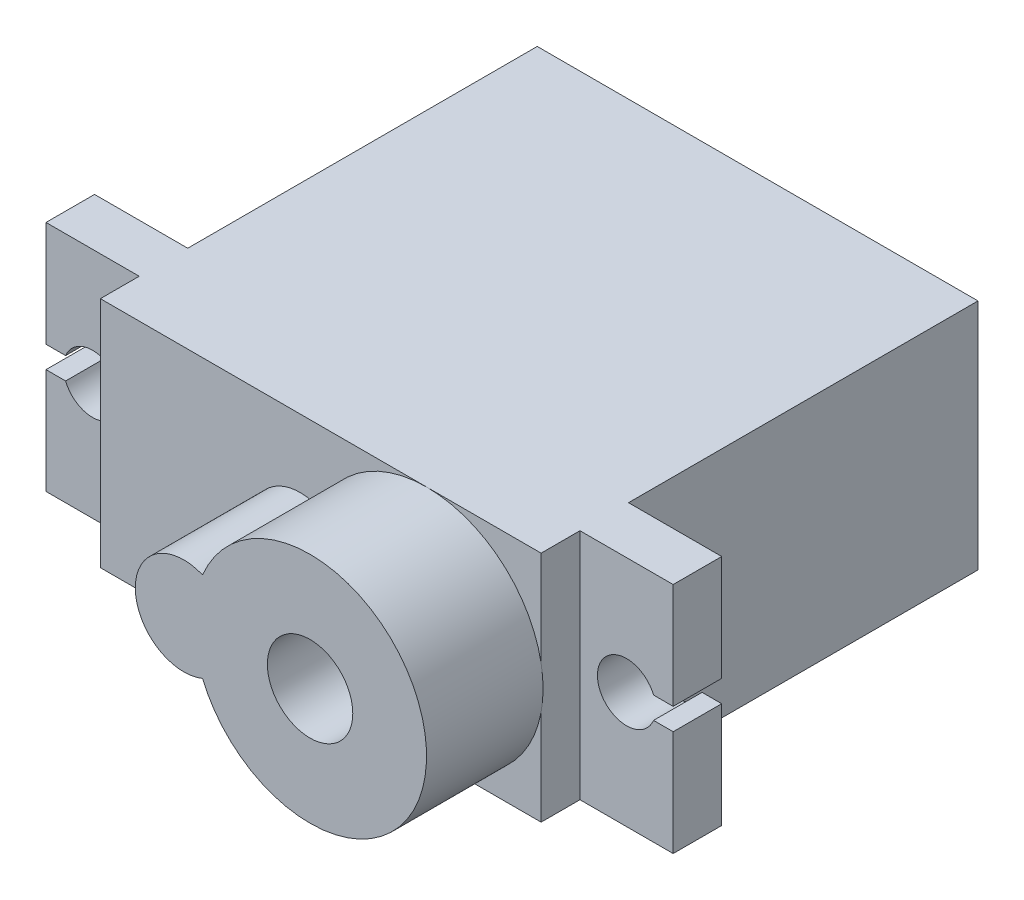
ISO-10303-21;
HEADER;
FILE_DESCRIPTION(('STEP AP214'),'2;1');
FILE_NAME('part.step','',(''),(''),'','','');
FILE_SCHEMA(('AUTOMOTIVE_DESIGN { 1 0 10303 214 1 1 1 1 }'));
ENDSEC;
DATA;
#1=APPLICATION_CONTEXT('core data for automotive mechanical design processes');
#2=APPLICATION_PROTOCOL_DEFINITION('international standard','automotive_design',2000,#1);
#3=PRODUCT_CONTEXT('',#1,'mechanical');
#4=PRODUCT('Part','Part','',(#3));
#5=PRODUCT_RELATED_PRODUCT_CATEGORY('part','',(#4));
#6=PRODUCT_DEFINITION_FORMATION('','',#4);
#7=PRODUCT_DEFINITION_CONTEXT('part definition',#1,'design');
#8=PRODUCT_DEFINITION('design','',#6,#7);
#9=PRODUCT_DEFINITION_SHAPE('','',#8);
#10=(LENGTH_UNIT() NAMED_UNIT(*) SI_UNIT(.MILLI.,.METRE.));
#11=(NAMED_UNIT(*) PLANE_ANGLE_UNIT() SI_UNIT($,.RADIAN.));
#12=(NAMED_UNIT(*) SI_UNIT($,.STERADIAN.) SOLID_ANGLE_UNIT());
#13=UNCERTAINTY_MEASURE_WITH_UNIT(LENGTH_MEASURE(1.E-05),#10,'distance_accuracy_value','');
#14=(GEOMETRIC_REPRESENTATION_CONTEXT(3) GLOBAL_UNCERTAINTY_ASSIGNED_CONTEXT((#13)) GLOBAL_UNIT_ASSIGNED_CONTEXT((#10,
#11,#12)) REPRESENTATION_CONTEXT('',''));
#15=CARTESIAN_POINT('',(0.,0.,0.));
#16=DIRECTION('',(0.,0.,1.));
#17=DIRECTION('',(1.,0.,0.));
#18=AXIS2_PLACEMENT_3D('',#15,#16,#17);
#19=CARTESIAN_POINT('',(-3.68951663117515,5.43498351110742,16.3));
#20=DIRECTION('',(0.,1.,0.));
#21=DIRECTION('',(1.,0.,0.));
#22=AXIS2_PLACEMENT_3D('',#19,#20,#21);
#23=PLANE('',#22);
#24=DIRECTION('',(-1.,0.,0.));
#25=VECTOR('',#24,1.);
#26=CARTESIAN_POINT('',(3.88024168441243,5.43498351110743,18.));
#27=LINE('',#26,#25);
#28=CARTESIAN_POINT('',(-3.68951663117515,5.43498351110742,18.));
#29=VERTEX_POINT('',#28);
#30=CARTESIAN_POINT('',(-4.7,5.43498351110742,18.));
#31=VERTEX_POINT('',#30);
#32=EDGE_CURVE('E306',#29,#31,#27,.T.);
#33=ORIENTED_EDGE('',*,*,#32,.T.);
#34=DIRECTION('',(0.,0.,1.));
#35=VECTOR('',#34,1.);
#36=CARTESIAN_POINT('',(-4.7,5.43498351110742,16.3));
#37=LINE('',#36,#35);
#38=CARTESIAN_POINT('',(-4.7,5.43498351110742,20.5));
#39=VERTEX_POINT('',#38);
#40=EDGE_CURVE('E11',#31,#39,#37,.T.);
#41=ORIENTED_EDGE('',*,*,#40,.T.);
#42=DIRECTION('',(-1.,0.,0.));
#43=VECTOR('',#42,1.);
#44=CARTESIAN_POINT('',(3.88024168441243,5.43498351110743,20.5));
#45=LINE('',#44,#43);
#46=CARTESIAN_POINT('',(-3.68951663117515,5.43498351110742,20.5));
#47=VERTEX_POINT('',#46);
#48=EDGE_CURVE('E331',#47,#39,#45,.T.);
#49=ORIENTED_EDGE('',*,*,#48,.F.);
#50=DIRECTION('',(0.,0.,1.));
#51=VECTOR('',#50,1.);
#52=CARTESIAN_POINT('',(-3.68951663117515,5.43498351110742,16.3));
#53=LINE('',#52,#51);
#54=EDGE_CURVE('E312',#29,#47,#53,.T.);
#55=ORIENTED_EDGE('',*,*,#54,.F.);
#56=EDGE_LOOP('',(#33,#41,#49,#55));
#57=FACE_BOUND('',#56,.T.);
#58=ADVANCED_FACE('F17',(#57),#23,.T.);
#59=CARTESIAN_POINT('',(-4.7,5.43498351110742,16.3));
#60=DIRECTION('',(-1.,0.,0.));
#61=DIRECTION('',(0.,0.,1.));
#62=AXIS2_PLACEMENT_3D('',#59,#60,#61);
#63=PLANE('',#62);
#64=DIRECTION('',(0.,-1.,0.));
#65=VECTOR('',#64,1.);
#66=CARTESIAN_POINT('',(-4.7,5.71749175555371,18.));
#67=LINE('',#66,#65);
#68=CARTESIAN_POINT('',(-4.7,0.,18.));
#69=VERTEX_POINT('',#68);
#70=EDGE_CURVE('E303',#31,#69,#67,.T.);
#71=ORIENTED_EDGE('',*,*,#70,.T.);
#72=DIRECTION('',(0.,0.,1.));
#73=VECTOR('',#72,1.);
#74=CARTESIAN_POINT('',(-4.7,0.,12.225));
#75=LINE('',#74,#73);
#76=CARTESIAN_POINT('',(-4.7,0.,20.5));
#77=VERTEX_POINT('',#76);
#78=EDGE_CURVE('E506',#69,#77,#75,.T.);
#79=ORIENTED_EDGE('',*,*,#78,.T.);
#80=DIRECTION('',(0.,-1.,0.));
#81=VECTOR('',#80,1.);
#82=CARTESIAN_POINT('',(-4.7,5.71749175555371,20.5));
#83=LINE('',#82,#81);
#84=EDGE_CURVE('E335',#39,#77,#83,.T.);
#85=ORIENTED_EDGE('',*,*,#84,.F.);
#86=ORIENTED_EDGE('',*,*,#40,.F.);
#87=EDGE_LOOP('',(#71,#79,#85,#86));
#88=FACE_BOUND('',#87,.T.);
#89=ADVANCED_FACE('F578',(#88),#63,.T.);
#90=CARTESIAN_POINT('',(27.6,0.,16.3));
#91=DIRECTION('',(1.,0.,0.));
#92=DIRECTION('',(0.,1.,0.));
#93=AXIS2_PLACEMENT_3D('',#90,#91,#92);
#94=PLANE('',#93);
#95=DIRECTION('',(0.,1.,0.));
#96=VECTOR('',#95,1.);
#97=CARTESIAN_POINT('',(27.6,3.,18.));
#98=LINE('',#97,#96);
#99=CARTESIAN_POINT('',(27.6,0.,18.));
#100=VERTEX_POINT('',#99);
#101=CARTESIAN_POINT('',(27.6,5.43498351110742,18.));
#102=VERTEX_POINT('',#101);
#103=EDGE_CURVE('E450',#100,#102,#98,.T.);
#104=ORIENTED_EDGE('',*,*,#103,.T.);
#105=DIRECTION('',(0.,0.,1.));
#106=VECTOR('',#105,1.);
#107=CARTESIAN_POINT('',(27.6,5.43498351110742,16.3));
#108=LINE('',#107,#106);
#109=CARTESIAN_POINT('',(27.6,5.43498351110742,20.5));
#110=VERTEX_POINT('',#109);
#111=EDGE_CURVE('E20',#102,#110,#108,.T.);
#112=ORIENTED_EDGE('',*,*,#111,.T.);
#113=DIRECTION('',(0.,1.,0.));
#114=VECTOR('',#113,1.);
#115=CARTESIAN_POINT('',(27.6,3.,20.5));
#116=LINE('',#115,#114);
#117=CARTESIAN_POINT('',(27.6,0.,20.5));
#118=VERTEX_POINT('',#117);
#119=EDGE_CURVE('E391',#118,#110,#116,.T.);
#120=ORIENTED_EDGE('',*,*,#119,.F.);
#121=DIRECTION('',(0.,0.,1.));
#122=VECTOR('',#121,1.);
#123=CARTESIAN_POINT('',(27.6,0.,12.225));
#124=LINE('',#123,#122);
#125=EDGE_CURVE('E277',#100,#118,#124,.T.);
#126=ORIENTED_EDGE('',*,*,#125,.F.);
#127=EDGE_LOOP('',(#104,#112,#120,#126));
#128=FACE_BOUND('',#127,.T.);
#129=ADVANCED_FACE('F603',(#128),#94,.T.);
#130=CARTESIAN_POINT('',(27.7,5.43498351110742,16.3));
#131=DIRECTION('',(0.,1.,0.));
#132=DIRECTION('',(1.,0.,0.));
#133=AXIS2_PLACEMENT_3D('',#130,#131,#132);
#134=PLANE('',#133);
#135=DIRECTION('',(1.,0.,0.));
#136=VECTOR('',#135,1.);
#137=CARTESIAN_POINT('',(19.575,5.43498351110743,18.));
#138=LINE('',#137,#136);
#139=CARTESIAN_POINT('',(26.5895166311751,5.43498351110742,18.));
#140=VERTEX_POINT('',#139);
#141=EDGE_CURVE('E446',#140,#102,#138,.T.);
#142=ORIENTED_EDGE('',*,*,#141,.F.);
#143=DIRECTION('',(0.,0.,1.));
#144=VECTOR('',#143,1.);
#145=CARTESIAN_POINT('',(26.5895166311751,5.43498351110742,16.3));
#146=LINE('',#145,#144);
#147=CARTESIAN_POINT('',(26.5895166311751,5.43498351110742,20.5));
#148=VERTEX_POINT('',#147);
#149=EDGE_CURVE('E396',#140,#148,#146,.T.);
#150=ORIENTED_EDGE('',*,*,#149,.T.);
#151=DIRECTION('',(-1.,0.,0.));
#152=VECTOR('',#151,1.);
#153=CARTESIAN_POINT('',(19.575,5.43498351110743,20.5));
#154=LINE('',#153,#152);
#155=EDGE_CURVE('E395',#110,#148,#154,.T.);
#156=ORIENTED_EDGE('',*,*,#155,.F.);
#157=ORIENTED_EDGE('',*,*,#111,.F.);
#158=EDGE_LOOP('',(#142,#150,#156,#157));
#159=FACE_BOUND('',#158,.T.);
#160=ADVANCED_FACE('F607',(#159),#134,.T.);
#161=CARTESIAN_POINT('',(25.2,6.,16.3));
#162=DIRECTION('',(0.,0.,1.));
#163=DIRECTION('',(-1.,0.,0.));
#164=AXIS2_PLACEMENT_3D('',#161,#162,#163);
#165=CYLINDRICAL_SURFACE('',#164,1.50000003367761);
#166=CARTESIAN_POINT('',(25.2,6.,18.));
#167=DIRECTION('',(0.,0.,1.));
#168=DIRECTION('',(-1.,0.,0.));
#169=AXIS2_PLACEMENT_3D('',#166,#167,#168);
#170=CIRCLE('',#169,1.50000003367761);
#171=CARTESIAN_POINT('',(26.5895166311751,6.56501648889258,18.));
#172=VERTEX_POINT('',#171);
#173=EDGE_CURVE('E441',#172,#140,#170,.T.);
#174=ORIENTED_EDGE('',*,*,#173,.F.);
#175=DIRECTION('',(0.,0.,1.));
#176=VECTOR('',#175,1.);
#177=CARTESIAN_POINT('',(26.5895166311751,6.56501648889258,16.3));
#178=LINE('',#177,#176);
#179=CARTESIAN_POINT('',(26.5895166311751,6.56501648889258,20.5));
#180=VERTEX_POINT('',#179);
#181=EDGE_CURVE('E399',#172,#180,#178,.T.);
#182=ORIENTED_EDGE('',*,*,#181,.T.);
#183=CARTESIAN_POINT('',(25.2,6.,20.5));
#184=DIRECTION('',(0.,0.,-1.));
#185=DIRECTION('',(-1.,0.,0.));
#186=AXIS2_PLACEMENT_3D('',#183,#184,#185);
#187=CIRCLE('',#186,1.50000003367761);
#188=EDGE_CURVE('E285',#148,#180,#187,.T.);
#189=ORIENTED_EDGE('',*,*,#188,.F.);
#190=ORIENTED_EDGE('',*,*,#149,.F.);
#191=EDGE_LOOP('',(#174,#182,#189,#190));
#192=FACE_BOUND('',#191,.T.);
#193=ADVANCED_FACE('F613',(#192),#165,.F.);
#194=CARTESIAN_POINT('',(26.5895166311751,6.56501648889258,16.3));
#195=DIRECTION('',(0.,-1.,0.));
#196=DIRECTION('',(0.,0.,-1.));
#197=AXIS2_PLACEMENT_3D('',#194,#195,#196);
#198=PLANE('',#197);
#199=DIRECTION('',(1.,0.,0.));
#200=VECTOR('',#199,1.);
#201=CARTESIAN_POINT('',(19.0197583155876,6.56501648889257,18.));
#202=LINE('',#201,#200);
#203=CARTESIAN_POINT('',(27.6,6.56501648889258,18.));
#204=VERTEX_POINT('',#203);
#205=EDGE_CURVE('E435',#172,#204,#202,.T.);
#206=ORIENTED_EDGE('',*,*,#205,.T.);
#207=DIRECTION('',(0.,0.,1.));
#208=VECTOR('',#207,1.);
#209=CARTESIAN_POINT('',(27.6,6.56501648889258,16.3));
#210=LINE('',#209,#208);
#211=CARTESIAN_POINT('',(27.6,6.56501648889258,20.5));
#212=VERTEX_POINT('',#211);
#213=EDGE_CURVE('E469',#204,#212,#210,.T.);
#214=ORIENTED_EDGE('',*,*,#213,.T.);
#215=DIRECTION('',(1.,0.,0.));
#216=VECTOR('',#215,1.);
#217=CARTESIAN_POINT('',(19.0197583155876,6.56501648889257,20.5));
#218=LINE('',#217,#216);
#219=EDGE_CURVE('E281',#180,#212,#218,.T.);
#220=ORIENTED_EDGE('',*,*,#219,.F.);
#221=ORIENTED_EDGE('',*,*,#181,.F.);
#222=EDGE_LOOP('',(#206,#214,#220,#221));
#223=FACE_BOUND('',#222,.T.);
#224=ADVANCED_FACE('F615',(#223),#198,.T.);
#225=CARTESIAN_POINT('',(27.6,6.56501648889258,16.3));
#226=DIRECTION('',(1.,0.,0.));
#227=DIRECTION('',(0.,1.,0.));
#228=AXIS2_PLACEMENT_3D('',#225,#226,#227);
#229=PLANE('',#228);
#230=DIRECTION('',(0.,1.,0.));
#231=VECTOR('',#230,1.);
#232=CARTESIAN_POINT('',(27.6,6.28250824444629,18.));
#233=LINE('',#232,#231);
#234=CARTESIAN_POINT('',(27.6,12.,18.));
#235=VERTEX_POINT('',#234);
#236=EDGE_CURVE('E432',#204,#235,#233,.T.);
#237=ORIENTED_EDGE('',*,*,#236,.T.);
#238=DIRECTION('',(0.,0.,1.));
#239=VECTOR('',#238,1.);
#240=CARTESIAN_POINT('',(27.6,12.,12.225));
#241=LINE('',#240,#239);
#242=CARTESIAN_POINT('',(27.6,12.,20.5));
#243=VERTEX_POINT('',#242);
#244=EDGE_CURVE('E358',#235,#243,#241,.T.);
#245=ORIENTED_EDGE('',*,*,#244,.T.);
#246=DIRECTION('',(0.,1.,0.));
#247=VECTOR('',#246,1.);
#248=CARTESIAN_POINT('',(27.6,6.28250824444629,20.5));
#249=LINE('',#248,#247);
#250=EDGE_CURVE('E284',#212,#243,#249,.T.);
#251=ORIENTED_EDGE('',*,*,#250,.F.);
#252=ORIENTED_EDGE('',*,*,#213,.F.);
#253=EDGE_LOOP('',(#237,#245,#251,#252));
#254=FACE_BOUND('',#253,.T.);
#255=ADVANCED_FACE('F597',(#254),#229,.T.);
#256=CARTESIAN_POINT('',(-4.7,12.,16.3));
#257=DIRECTION('',(-1.,0.,0.));
#258=DIRECTION('',(0.,0.,1.));
#259=AXIS2_PLACEMENT_3D('',#256,#257,#258);
#260=PLANE('',#259);
#261=DIRECTION('',(0.,-1.,0.));
#262=VECTOR('',#261,1.);
#263=CARTESIAN_POINT('',(-4.7,9.,18.));
#264=LINE('',#263,#262);
#265=CARTESIAN_POINT('',(-4.7,12.,18.));
#266=VERTEX_POINT('',#265);
#267=CARTESIAN_POINT('',(-4.7,6.56501648889258,18.));
#268=VERTEX_POINT('',#267);
#269=EDGE_CURVE('E428',#266,#268,#264,.T.);
#270=ORIENTED_EDGE('',*,*,#269,.T.);
#271=DIRECTION('',(0.,0.,1.));
#272=VECTOR('',#271,1.);
#273=CARTESIAN_POINT('',(-4.7,6.56501648889258,16.3));
#274=LINE('',#273,#272);
#275=CARTESIAN_POINT('',(-4.7,6.56501648889258,20.5));
#276=VERTEX_POINT('',#275);
#277=EDGE_CURVE('E467',#268,#276,#274,.T.);
#278=ORIENTED_EDGE('',*,*,#277,.T.);
#279=DIRECTION('',(0.,-1.,0.));
#280=VECTOR('',#279,1.);
#281=CARTESIAN_POINT('',(-4.7,9.,20.5));
#282=LINE('',#281,#280);
#283=CARTESIAN_POINT('',(-4.7,12.,20.5));
#284=VERTEX_POINT('',#283);
#285=EDGE_CURVE('E319',#284,#276,#282,.T.);
#286=ORIENTED_EDGE('',*,*,#285,.F.);
#287=DIRECTION('',(0.,0.,1.));
#288=VECTOR('',#287,1.);
#289=CARTESIAN_POINT('',(-4.7,12.,12.225));
#290=LINE('',#289,#288);
#291=EDGE_CURVE('E336',#266,#284,#290,.T.);
#292=ORIENTED_EDGE('',*,*,#291,.F.);
#293=EDGE_LOOP('',(#270,#278,#286,#292));
#294=FACE_BOUND('',#293,.T.);
#295=ADVANCED_FACE('F564',(#294),#260,.T.);
#296=CARTESIAN_POINT('',(-4.8,6.56501648889258,16.3));
#297=DIRECTION('',(0.,-1.,0.));
#298=DIRECTION('',(-1.,0.,0.));
#299=AXIS2_PLACEMENT_3D('',#296,#297,#298);
#300=PLANE('',#299);
#301=DIRECTION('',(-1.,0.,0.));
#302=VECTOR('',#301,1.);
#303=CARTESIAN_POINT('',(3.325,6.56501648889257,18.));
#304=LINE('',#303,#302);
#305=CARTESIAN_POINT('',(-3.68951663117515,6.56501648889258,18.));
#306=VERTEX_POINT('',#305);
#307=EDGE_CURVE('E424',#306,#268,#304,.T.);
#308=ORIENTED_EDGE('',*,*,#307,.F.);
#309=DIRECTION('',(0.,0.,1.));
#310=VECTOR('',#309,1.);
#311=CARTESIAN_POINT('',(-3.68951663117515,6.56501648889258,16.3));
#312=LINE('',#311,#310);
#313=CARTESIAN_POINT('',(-3.68951663117515,6.56501648889258,20.5));
#314=VERTEX_POINT('',#313);
#315=EDGE_CURVE('E315',#306,#314,#312,.T.);
#316=ORIENTED_EDGE('',*,*,#315,.T.);
#317=DIRECTION('',(1.,0.,0.));
#318=VECTOR('',#317,1.);
#319=CARTESIAN_POINT('',(3.325,6.56501648889257,20.5));
#320=LINE('',#319,#318);
#321=EDGE_CURVE('E323',#276,#314,#320,.T.);
#322=ORIENTED_EDGE('',*,*,#321,.F.);
#323=ORIENTED_EDGE('',*,*,#277,.F.);
#324=EDGE_LOOP('',(#308,#316,#322,#323));
#325=FACE_BOUND('',#324,.T.);
#326=ADVANCED_FACE('F587',(#325),#300,.T.);
#327=CARTESIAN_POINT('',(-2.3,6.,16.3));
#328=DIRECTION('',(0.,0.,1.));
#329=DIRECTION('',(1.,0.,0.));
#330=AXIS2_PLACEMENT_3D('',#327,#328,#329);
#331=CYLINDRICAL_SURFACE('',#330,1.50000003367761);
#332=CARTESIAN_POINT('',(-2.3,6.,18.));
#333=DIRECTION('',(0.,0.,1.));
#334=DIRECTION('',(1.,0.,0.));
#335=AXIS2_PLACEMENT_3D('',#332,#333,#334);
#336=CIRCLE('',#335,1.50000003367761);
#337=EDGE_CURVE('E388',#29,#306,#336,.T.);
#338=ORIENTED_EDGE('',*,*,#337,.F.);
#339=ORIENTED_EDGE('',*,*,#54,.T.);
#340=CARTESIAN_POINT('',(-2.3,6.,20.5));
#341=DIRECTION('',(0.,0.,-1.));
#342=DIRECTION('',(1.,0.,0.));
#343=AXIS2_PLACEMENT_3D('',#340,#341,#342);
#344=CIRCLE('',#343,1.50000003367761);
#345=EDGE_CURVE('E327',#314,#47,#344,.T.);
#346=ORIENTED_EDGE('',*,*,#345,.F.);
#347=ORIENTED_EDGE('',*,*,#315,.F.);
#348=EDGE_LOOP('',(#338,#339,#346,#347));
#349=FACE_BOUND('',#348,.T.);
#350=ADVANCED_FACE('F585',(#349),#331,.F.);
#351=CARTESIAN_POINT('',(16.9,6.,22.8));
#352=DIRECTION('',(0.,0.,1.));
#353=DIRECTION('',(1.,0.,0.));
#354=AXIS2_PLACEMENT_3D('',#351,#352,#353);
#355=CYLINDRICAL_SURFACE('',#354,6.);
#356=CARTESIAN_POINT('',(16.9,6.,22.5));
#357=DIRECTION('',(0.,0.,1.));
#358=DIRECTION('',(-0.923076923076922,-0.384615384615386,0.));
#359=AXIS2_PLACEMENT_3D('',#356,#357,#358);
#360=CIRCLE('',#359,6.);
#361=CARTESIAN_POINT('',(22.8,7.09087121146356,22.5));
#362=VERTEX_POINT('',#361);
#363=CARTESIAN_POINT('',(16.9,12.,22.5));
#364=VERTEX_POINT('',#363);
#365=EDGE_CURVE('E454',#362,#364,#360,.T.);
#366=ORIENTED_EDGE('',*,*,#365,.T.);
#367=CARTESIAN_POINT('',(16.9,6.,22.5));
#368=DIRECTION('',(0.,0.,-1.));
#369=DIRECTION('',(1.,0.,0.));
#370=AXIS2_PLACEMENT_3D('',#367,#368,#369);
#371=CIRCLE('',#370,6.);
#372=CARTESIAN_POINT('',(11.3615384615385,8.30769230769232,22.5));
#373=VERTEX_POINT('',#372);
#374=EDGE_CURVE('E353',#373,#364,#371,.T.);
#375=ORIENTED_EDGE('',*,*,#374,.F.);
#376=DIRECTION('',(0.,0.,-1.));
#377=VECTOR('',#376,1.);
#378=CARTESIAN_POINT('',(11.3615384615385,8.30769230769232,22.8));
#379=LINE('',#378,#377);
#380=CARTESIAN_POINT('',(11.3615384615385,8.30769230769232,28.5));
#381=VERTEX_POINT('',#380);
#382=EDGE_CURVE('E48',#381,#373,#379,.T.);
#383=ORIENTED_EDGE('',*,*,#382,.F.);
#384=CARTESIAN_POINT('',(16.9,6.,28.5));
#385=DIRECTION('',(0.,0.,1.));
#386=DIRECTION('',(-0.923076923076922,-0.384615384615386,0.));
#387=AXIS2_PLACEMENT_3D('',#384,#385,#386);
#388=CIRCLE('',#387,6.);
#389=CARTESIAN_POINT('',(11.3615384615385,3.69230769230768,28.5));
#390=VERTEX_POINT('',#389);
#391=EDGE_CURVE('E495',#390,#381,#388,.T.);
#392=ORIENTED_EDGE('',*,*,#391,.F.);
#393=DIRECTION('',(0.,0.,1.));
#394=VECTOR('',#393,1.);
#395=CARTESIAN_POINT('',(11.3615384615385,3.69230769230768,22.8));
#396=LINE('',#395,#394);
#397=CARTESIAN_POINT('',(11.3615384615385,3.69230769230768,22.5));
#398=VERTEX_POINT('',#397);
#399=EDGE_CURVE('E414',#398,#390,#396,.T.);
#400=ORIENTED_EDGE('',*,*,#399,.F.);
#401=CARTESIAN_POINT('',(16.9,6.,22.5));
#402=DIRECTION('',(0.,0.,-1.));
#403=DIRECTION('',(1.,0.,0.));
#404=AXIS2_PLACEMENT_3D('',#401,#402,#403);
#405=CIRCLE('',#404,6.);
#406=CARTESIAN_POINT('',(16.9,0.,22.5));
#407=VERTEX_POINT('',#406);
#408=EDGE_CURVE('E354',#407,#398,#405,.T.);
#409=ORIENTED_EDGE('',*,*,#408,.F.);
#410=CARTESIAN_POINT('',(16.9,6.,22.5));
#411=DIRECTION('',(0.,0.,1.));
#412=DIRECTION('',(-0.923076923076922,-0.384615384615386,0.));
#413=AXIS2_PLACEMENT_3D('',#410,#411,#412);
#414=CIRCLE('',#413,6.);
#415=CARTESIAN_POINT('',(22.8,4.90912878853644,22.5));
#416=VERTEX_POINT('',#415);
#417=EDGE_CURVE('E259',#407,#416,#414,.T.);
#418=ORIENTED_EDGE('',*,*,#417,.T.);
#419=CARTESIAN_POINT('',(16.9,6.,22.5));
#420=DIRECTION('',(0.,0.,-1.));
#421=DIRECTION('',(1.,0.,0.));
#422=AXIS2_PLACEMENT_3D('',#419,#420,#421);
#423=CIRCLE('',#422,6.);
#424=EDGE_CURVE('E375',#362,#416,#423,.T.);
#425=ORIENTED_EDGE('',*,*,#424,.F.);
#426=EDGE_LOOP('',(#366,#375,#383,#392,#400,#409,#418,#425));
#427=FACE_BOUND('',#426,.T.);
#428=ADVANCED_FACE('F595',(#427),#355,.T.);
#429=CARTESIAN_POINT('',(10.4,6.,22.8));
#430=DIRECTION('',(0.,0.,1.));
#431=DIRECTION('',(-1.,0.,0.));
#432=AXIS2_PLACEMENT_3D('',#429,#430,#431);
#433=CYLINDRICAL_SURFACE('',#432,2.5);
#434=ORIENTED_EDGE('',*,*,#399,.T.);
#435=CARTESIAN_POINT('',(10.4,6.,28.5));
#436=DIRECTION('',(0.,0.,1.));
#437=DIRECTION('',(0.384615384615384,0.923076923076923,0.));
#438=AXIS2_PLACEMENT_3D('',#435,#436,#437);
#439=CIRCLE('',#438,2.5);
#440=EDGE_CURVE('E490',#381,#390,#439,.T.);
#441=ORIENTED_EDGE('',*,*,#440,.F.);
#442=ORIENTED_EDGE('',*,*,#382,.T.);
#443=CARTESIAN_POINT('',(10.4,6.,22.5));
#444=DIRECTION('',(0.,0.,1.));
#445=DIRECTION('',(0.384615384615384,0.923076923076923,0.));
#446=AXIS2_PLACEMENT_3D('',#443,#444,#445);
#447=CIRCLE('',#446,2.5);
#448=EDGE_CURVE('E350',#373,#398,#447,.T.);
#449=ORIENTED_EDGE('',*,*,#448,.T.);
#450=EDGE_LOOP('',(#434,#441,#442,#449));
#451=FACE_BOUND('',#450,.T.);
#452=ADVANCED_FACE('F640',(#451),#433,.T.);
#453=CARTESIAN_POINT('',(16.9,6.,22.8));
#454=DIRECTION('',(0.,0.,1.));
#455=DIRECTION('',(1.,0.,0.));
#456=AXIS2_PLACEMENT_3D('',#453,#454,#455);
#457=PLANE('',#456);
#458=CARTESIAN_POINT('',(16.9,6.,22.8));
#459=DIRECTION('',(0.,0.,1.));
#460=DIRECTION('',(-1.,0.,0.));
#461=AXIS2_PLACEMENT_3D('',#458,#459,#460);
#462=CIRCLE('',#461,2.2);
#463=CARTESIAN_POINT('',(19.1,6.,22.8));
#464=VERTEX_POINT('',#463);
#465=EDGE_CURVE('E438',#464,#464,#462,.T.);
#466=ORIENTED_EDGE('',*,*,#465,.T.);
#467=EDGE_LOOP('',(#466));
#468=FACE_BOUND('',#467,.T.);
#469=ADVANCED_FACE('F650',(#468),#457,.T.);
#470=CARTESIAN_POINT('',(16.9,6.,22.8));
#471=DIRECTION('',(0.,0.,1.));
#472=DIRECTION('',(-1.,0.,0.));
#473=AXIS2_PLACEMENT_3D('',#470,#471,#472);
#474=CYLINDRICAL_SURFACE('',#473,2.2);
#475=ORIENTED_EDGE('',*,*,#465,.F.);
#476=DIRECTION('',(0.,0.,1.));
#477=VECTOR('',#476,1.);
#478=CARTESIAN_POINT('',(19.1,6.,22.8));
#479=LINE('',#478,#477);
#480=CARTESIAN_POINT('',(19.1,6.,28.5));
#481=VERTEX_POINT('',#480);
#482=EDGE_CURVE('E38',#464,#481,#479,.T.);
#483=ORIENTED_EDGE('',*,*,#482,.T.);
#484=CARTESIAN_POINT('',(16.9,6.,28.5));
#485=DIRECTION('',(0.,0.,-1.));
#486=DIRECTION('',(-1.,0.,0.));
#487=AXIS2_PLACEMENT_3D('',#484,#485,#486);
#488=CIRCLE('',#487,2.2);
#489=EDGE_CURVE('E494',#481,#481,#488,.T.);
#490=ORIENTED_EDGE('',*,*,#489,.F.);
#491=ORIENTED_EDGE('',*,*,#482,.F.);
#492=EDGE_LOOP('',(#475,#483,#490,#491));
#493=FACE_BOUND('',#492,.T.);
#494=ADVANCED_FACE('F651',(#493),#474,.F.);
#495=CARTESIAN_POINT('',(11.45,6.,22.5));
#496=DIRECTION('',(0.,0.,1.));
#497=DIRECTION('',(1.,0.,0.));
#498=AXIS2_PLACEMENT_3D('',#495,#496,#497);
#499=PLANE('',#498);
#500=DIRECTION('',(0.,-1.,0.));
#501=VECTOR('',#500,1.);
#502=CARTESIAN_POINT('',(22.8,3.,22.5));
#503=LINE('',#502,#501);
#504=CARTESIAN_POINT('',(22.8,0.,22.5));
#505=VERTEX_POINT('',#504);
#506=EDGE_CURVE('E243',#416,#505,#503,.T.);
#507=ORIENTED_EDGE('',*,*,#506,.F.);
#508=ORIENTED_EDGE('',*,*,#417,.F.);
#509=DIRECTION('',(-1.,0.,0.));
#510=VECTOR('',#509,1.);
#511=CARTESIAN_POINT('',(11.45,0.,22.5));
#512=LINE('',#511,#510);
#513=EDGE_CURVE('E257',#505,#407,#512,.T.);
#514=ORIENTED_EDGE('',*,*,#513,.F.);
#515=EDGE_LOOP('',(#507,#508,#514));
#516=FACE_BOUND('',#515,.T.);
#517=ADVANCED_FACE('F258',(#516),#499,.T.);
#518=CARTESIAN_POINT('',(11.45,6.,22.5));
#519=DIRECTION('',(0.,0.,1.));
#520=DIRECTION('',(1.,0.,0.));
#521=AXIS2_PLACEMENT_3D('',#518,#519,#520);
#522=PLANE('',#521);
#523=DIRECTION('',(0.,-1.,0.));
#524=VECTOR('',#523,1.);
#525=CARTESIAN_POINT('',(22.8,3.,22.5));
#526=LINE('',#525,#524);
#527=EDGE_CURVE('E251',#362,#416,#526,.T.);
#528=ORIENTED_EDGE('',*,*,#527,.F.);
#529=ORIENTED_EDGE('',*,*,#424,.T.);
#530=EDGE_LOOP('',(#528,#529));
#531=FACE_BOUND('',#530,.T.);
#532=ADVANCED_FACE('F637',(#531),#522,.F.);
#533=CARTESIAN_POINT('',(11.45,6.,22.5));
#534=DIRECTION('',(0.,0.,1.));
#535=DIRECTION('',(1.,0.,0.));
#536=AXIS2_PLACEMENT_3D('',#533,#534,#535);
#537=PLANE('',#536);
#538=DIRECTION('',(-1.,0.,0.));
#539=VECTOR('',#538,1.);
#540=CARTESIAN_POINT('',(11.45,0.,22.5));
#541=LINE('',#540,#539);
#542=CARTESIAN_POINT('',(0.1,0.,22.5));
#543=VERTEX_POINT('',#542);
#544=EDGE_CURVE('E264',#407,#543,#541,.T.);
#545=ORIENTED_EDGE('',*,*,#544,.F.);
#546=ORIENTED_EDGE('',*,*,#408,.T.);
#547=ORIENTED_EDGE('',*,*,#448,.F.);
#548=ORIENTED_EDGE('',*,*,#374,.T.);
#549=DIRECTION('',(1.,0.,0.));
#550=VECTOR('',#549,1.);
#551=CARTESIAN_POINT('',(11.45,12.,22.5));
#552=LINE('',#551,#550);
#553=CARTESIAN_POINT('',(0.1,12.,22.5));
#554=VERTEX_POINT('',#553);
#555=EDGE_CURVE('E298',#554,#364,#552,.T.);
#556=ORIENTED_EDGE('',*,*,#555,.F.);
#557=DIRECTION('',(0.,1.,0.));
#558=VECTOR('',#557,1.);
#559=CARTESIAN_POINT('',(0.1,9.,22.5));
#560=LINE('',#559,#558);
#561=EDGE_CURVE('E288',#543,#554,#560,.T.);
#562=ORIENTED_EDGE('',*,*,#561,.F.);
#563=EDGE_LOOP('',(#545,#546,#547,#548,#556,#562));
#564=FACE_BOUND('',#563,.T.);
#565=ADVANCED_FACE('F573',(#564),#537,.T.);
#566=CARTESIAN_POINT('',(22.9,0.,0.));
#567=DIRECTION('',(0.,0.,-1.));
#568=DIRECTION('',(0.,-1.,0.));
#569=AXIS2_PLACEMENT_3D('',#566,#567,#568);
#570=PLANE('',#569);
#571=DIRECTION('',(0.,1.,0.));
#572=VECTOR('',#571,1.);
#573=CARTESIAN_POINT('',(0.1,0.,0.));
#574=LINE('',#573,#572);
#575=CARTESIAN_POINT('',(0.1,0.,0.));
#576=VERTEX_POINT('',#575);
#577=CARTESIAN_POINT('',(0.1,12.,0.));
#578=VERTEX_POINT('',#577);
#579=EDGE_CURVE('E410',#576,#578,#574,.T.);
#580=ORIENTED_EDGE('',*,*,#579,.T.);
#581=DIRECTION('',(-1.,0.,0.));
#582=VECTOR('',#581,1.);
#583=CARTESIAN_POINT('',(17.175,12.,0.));
#584=LINE('',#583,#582);
#585=CARTESIAN_POINT('',(22.8,12.,0.));
#586=VERTEX_POINT('',#585);
#587=EDGE_CURVE('E374',#586,#578,#584,.T.);
#588=ORIENTED_EDGE('',*,*,#587,.F.);
#589=DIRECTION('',(0.,1.,0.));
#590=VECTOR('',#589,1.);
#591=CARTESIAN_POINT('',(22.8,0.,0.));
#592=LINE('',#591,#590);
#593=CARTESIAN_POINT('',(22.8,0.,0.));
#594=VERTEX_POINT('',#593);
#595=EDGE_CURVE('E413',#594,#586,#592,.T.);
#596=ORIENTED_EDGE('',*,*,#595,.F.);
#597=DIRECTION('',(-1.,0.,0.));
#598=VECTOR('',#597,1.);
#599=CARTESIAN_POINT('',(17.175,0.,0.));
#600=LINE('',#599,#598);
#601=EDGE_CURVE('E488',#594,#576,#600,.T.);
#602=ORIENTED_EDGE('',*,*,#601,.T.);
#603=EDGE_LOOP('',(#580,#588,#596,#602));
#604=FACE_BOUND('',#603,.T.);
#605=ADVANCED_FACE('F539',(#604),#570,.T.);
#606=CARTESIAN_POINT('',(11.45,6.,22.5));
#607=DIRECTION('',(0.,0.,1.));
#608=DIRECTION('',(1.,0.,0.));
#609=AXIS2_PLACEMENT_3D('',#606,#607,#608);
#610=PLANE('',#609);
#611=DIRECTION('',(1.,0.,0.));
#612=VECTOR('',#611,1.);
#613=CARTESIAN_POINT('',(11.45,12.,22.5));
#614=LINE('',#613,#612);
#615=CARTESIAN_POINT('',(22.8,12.,22.5));
#616=VERTEX_POINT('',#615);
#617=EDGE_CURVE('E293',#364,#616,#614,.T.);
#618=ORIENTED_EDGE('',*,*,#617,.F.);
#619=ORIENTED_EDGE('',*,*,#365,.F.);
#620=DIRECTION('',(0.,-1.,0.));
#621=VECTOR('',#620,1.);
#622=CARTESIAN_POINT('',(22.8,3.,22.5));
#623=LINE('',#622,#621);
#624=EDGE_CURVE('E403',#616,#362,#623,.T.);
#625=ORIENTED_EDGE('',*,*,#624,.F.);
#626=EDGE_LOOP('',(#618,#619,#625));
#627=FACE_BOUND('',#626,.T.);
#628=ADVANCED_FACE('F634',(#627),#610,.T.);
#629=CARTESIAN_POINT('',(11.45,6.,18.));
#630=DIRECTION('',(0.,0.,1.));
#631=DIRECTION('',(1.,0.,0.));
#632=AXIS2_PLACEMENT_3D('',#629,#630,#631);
#633=PLANE('',#632);
#634=DIRECTION('',(0.,-1.,0.));
#635=VECTOR('',#634,1.);
#636=CARTESIAN_POINT('',(22.8,3.,18.));
#637=LINE('',#636,#635);
#638=CARTESIAN_POINT('',(22.8,12.,18.));
#639=VERTEX_POINT('',#638);
#640=CARTESIAN_POINT('',(22.8,0.,18.));
#641=VERTEX_POINT('',#640);
#642=EDGE_CURVE('E307',#639,#641,#637,.T.);
#643=ORIENTED_EDGE('',*,*,#642,.F.);
#644=DIRECTION('',(-1.,0.,0.));
#645=VECTOR('',#644,1.);
#646=CARTESIAN_POINT('',(11.45,12.,18.));
#647=LINE('',#646,#645);
#648=EDGE_CURVE('E362',#235,#639,#647,.T.);
#649=ORIENTED_EDGE('',*,*,#648,.F.);
#650=ORIENTED_EDGE('',*,*,#236,.F.);
#651=ORIENTED_EDGE('',*,*,#205,.F.);
#652=ORIENTED_EDGE('',*,*,#173,.T.);
#653=ORIENTED_EDGE('',*,*,#141,.T.);
#654=ORIENTED_EDGE('',*,*,#103,.F.);
#655=DIRECTION('',(1.,0.,0.));
#656=VECTOR('',#655,1.);
#657=CARTESIAN_POINT('',(11.45,0.,18.));
#658=LINE('',#657,#656);
#659=EDGE_CURVE('E526',#641,#100,#658,.T.);
#660=ORIENTED_EDGE('',*,*,#659,.F.);
#661=EDGE_LOOP('',(#643,#649,#650,#651,#652,#653,#654,#660));
#662=FACE_BOUND('',#661,.T.);
#663=ADVANCED_FACE('F548',(#662),#633,.F.);
#664=CARTESIAN_POINT('',(11.45,6.,18.));
#665=DIRECTION('',(0.,0.,1.));
#666=DIRECTION('',(1.,0.,0.));
#667=AXIS2_PLACEMENT_3D('',#664,#665,#666);
#668=PLANE('',#667);
#669=DIRECTION('',(0.,1.,0.));
#670=VECTOR('',#669,1.);
#671=CARTESIAN_POINT('',(0.1,3.,18.));
#672=LINE('',#671,#670);
#673=CARTESIAN_POINT('',(0.1,0.,18.));
#674=VERTEX_POINT('',#673);
#675=CARTESIAN_POINT('',(0.1,12.,18.));
#676=VERTEX_POINT('',#675);
#677=EDGE_CURVE('E254',#674,#676,#672,.T.);
#678=ORIENTED_EDGE('',*,*,#677,.F.);
#679=DIRECTION('',(1.,0.,0.));
#680=VECTOR('',#679,1.);
#681=CARTESIAN_POINT('',(11.45,0.,18.));
#682=LINE('',#681,#680);
#683=EDGE_CURVE('E489',#69,#674,#682,.T.);
#684=ORIENTED_EDGE('',*,*,#683,.F.);
#685=ORIENTED_EDGE('',*,*,#70,.F.);
#686=ORIENTED_EDGE('',*,*,#32,.F.);
#687=ORIENTED_EDGE('',*,*,#337,.T.);
#688=ORIENTED_EDGE('',*,*,#307,.T.);
#689=ORIENTED_EDGE('',*,*,#269,.F.);
#690=DIRECTION('',(-1.,0.,0.));
#691=VECTOR('',#690,1.);
#692=CARTESIAN_POINT('',(11.45,12.,18.));
#693=LINE('',#692,#691);
#694=EDGE_CURVE('E340',#676,#266,#693,.T.);
#695=ORIENTED_EDGE('',*,*,#694,.F.);
#696=EDGE_LOOP('',(#678,#684,#685,#686,#687,#688,#689,#695));
#697=FACE_BOUND('',#696,.T.);
#698=ADVANCED_FACE('F561',(#697),#668,.F.);
#699=CARTESIAN_POINT('',(22.8,0.,16.3));
#700=DIRECTION('',(1.,0.,0.));
#701=DIRECTION('',(0.,1.,0.));
#702=AXIS2_PLACEMENT_3D('',#699,#700,#701);
#703=PLANE('',#702);
#704=DIRECTION('',(0.,0.,-1.));
#705=VECTOR('',#704,1.);
#706=CARTESIAN_POINT('',(22.8,0.,12.225));
#707=LINE('',#706,#705);
#708=EDGE_CURVE('E501',#641,#594,#707,.T.);
#709=ORIENTED_EDGE('',*,*,#708,.T.);
#710=ORIENTED_EDGE('',*,*,#595,.T.);
#711=DIRECTION('',(0.,0.,-1.));
#712=VECTOR('',#711,1.);
#713=CARTESIAN_POINT('',(22.8,12.,12.225));
#714=LINE('',#713,#712);
#715=EDGE_CURVE('E366',#639,#586,#714,.T.);
#716=ORIENTED_EDGE('',*,*,#715,.F.);
#717=ORIENTED_EDGE('',*,*,#642,.T.);
#718=EDGE_LOOP('',(#709,#710,#716,#717));
#719=FACE_BOUND('',#718,.T.);
#720=ADVANCED_FACE('F535',(#719),#703,.T.);
#721=CARTESIAN_POINT('',(0.1,0.,0.));
#722=DIRECTION('',(-1.,0.,0.));
#723=DIRECTION('',(0.,0.,1.));
#724=AXIS2_PLACEMENT_3D('',#721,#722,#723);
#725=PLANE('',#724);
#726=DIRECTION('',(0.,0.,-1.));
#727=VECTOR('',#726,1.);
#728=CARTESIAN_POINT('',(0.1,0.,4.075));
#729=LINE('',#728,#727);
#730=EDGE_CURVE('E485',#674,#576,#729,.T.);
#731=ORIENTED_EDGE('',*,*,#730,.F.);
#732=ORIENTED_EDGE('',*,*,#677,.T.);
#733=DIRECTION('',(0.,0.,1.));
#734=VECTOR('',#733,1.);
#735=CARTESIAN_POINT('',(0.1,12.,4.075));
#736=LINE('',#735,#734);
#737=EDGE_CURVE('E370',#578,#676,#736,.T.);
#738=ORIENTED_EDGE('',*,*,#737,.F.);
#739=ORIENTED_EDGE('',*,*,#579,.F.);
#740=EDGE_LOOP('',(#731,#732,#738,#739));
#741=FACE_BOUND('',#740,.T.);
#742=ADVANCED_FACE('F556',(#741),#725,.T.);
#743=CARTESIAN_POINT('',(22.8,0.,16.3));
#744=DIRECTION('',(1.,0.,0.));
#745=DIRECTION('',(0.,1.,0.));
#746=AXIS2_PLACEMENT_3D('',#743,#744,#745);
#747=PLANE('',#746);
#748=DIRECTION('',(0.,-1.,0.));
#749=VECTOR('',#748,1.);
#750=CARTESIAN_POINT('',(22.8,3.,20.5));
#751=LINE('',#750,#749);
#752=CARTESIAN_POINT('',(22.8,12.,20.5));
#753=VERTEX_POINT('',#752);
#754=CARTESIAN_POINT('',(22.8,0.,20.5));
#755=VERTEX_POINT('',#754);
#756=EDGE_CURVE('E339',#753,#755,#751,.T.);
#757=ORIENTED_EDGE('',*,*,#756,.F.);
#758=DIRECTION('',(0.,0.,1.));
#759=VECTOR('',#758,1.);
#760=CARTESIAN_POINT('',(22.8,12.,12.225));
#761=LINE('',#760,#759);
#762=EDGE_CURVE('E297',#753,#616,#761,.T.);
#763=ORIENTED_EDGE('',*,*,#762,.T.);
#764=ORIENTED_EDGE('',*,*,#624,.T.);
#765=ORIENTED_EDGE('',*,*,#527,.T.);
#766=ORIENTED_EDGE('',*,*,#506,.T.);
#767=DIRECTION('',(0.,0.,1.));
#768=VECTOR('',#767,1.);
#769=CARTESIAN_POINT('',(22.8,0.,12.225));
#770=LINE('',#769,#768);
#771=EDGE_CURVE('E247',#755,#505,#770,.T.);
#772=ORIENTED_EDGE('',*,*,#771,.F.);
#773=EDGE_LOOP('',(#757,#763,#764,#765,#766,#772));
#774=FACE_BOUND('',#773,.T.);
#775=ADVANCED_FACE('F245',(#774),#747,.T.);
#776=CARTESIAN_POINT('',(11.45,6.,20.5));
#777=DIRECTION('',(0.,0.,1.));
#778=DIRECTION('',(1.,0.,0.));
#779=AXIS2_PLACEMENT_3D('',#776,#777,#778);
#780=PLANE('',#779);
#781=ORIENTED_EDGE('',*,*,#756,.T.);
#782=DIRECTION('',(1.,0.,0.));
#783=VECTOR('',#782,1.);
#784=CARTESIAN_POINT('',(11.45,0.,20.5));
#785=LINE('',#784,#783);
#786=EDGE_CURVE('E270',#755,#118,#785,.T.);
#787=ORIENTED_EDGE('',*,*,#786,.T.);
#788=ORIENTED_EDGE('',*,*,#119,.T.);
#789=ORIENTED_EDGE('',*,*,#155,.T.);
#790=ORIENTED_EDGE('',*,*,#188,.T.);
#791=ORIENTED_EDGE('',*,*,#219,.T.);
#792=ORIENTED_EDGE('',*,*,#250,.T.);
#793=DIRECTION('',(-1.,0.,0.));
#794=VECTOR('',#793,1.);
#795=CARTESIAN_POINT('',(11.45,12.,20.5));
#796=LINE('',#795,#794);
#797=EDGE_CURVE('E349',#243,#753,#796,.T.);
#798=ORIENTED_EDGE('',*,*,#797,.T.);
#799=EDGE_LOOP('',(#781,#787,#788,#789,#790,#791,#792,#798));
#800=FACE_BOUND('',#799,.T.);
#801=ADVANCED_FACE('F629',(#800),#780,.T.);
#802=CARTESIAN_POINT('',(11.45,12.,8.15));
#803=DIRECTION('',(0.,1.,0.));
#804=DIRECTION('',(1.,0.,0.));
#805=AXIS2_PLACEMENT_3D('',#802,#803,#804);
#806=PLANE('',#805);
#807=DIRECTION('',(0.,0.,1.));
#808=VECTOR('',#807,1.);
#809=CARTESIAN_POINT('',(0.1,12.,12.225));
#810=LINE('',#809,#808);
#811=CARTESIAN_POINT('',(0.1,12.,20.5));
#812=VERTEX_POINT('',#811);
#813=EDGE_CURVE('E292',#812,#554,#810,.T.);
#814=ORIENTED_EDGE('',*,*,#813,.T.);
#815=ORIENTED_EDGE('',*,*,#555,.T.);
#816=ORIENTED_EDGE('',*,*,#617,.T.);
#817=ORIENTED_EDGE('',*,*,#762,.F.);
#818=ORIENTED_EDGE('',*,*,#797,.F.);
#819=ORIENTED_EDGE('',*,*,#244,.F.);
#820=ORIENTED_EDGE('',*,*,#648,.T.);
#821=ORIENTED_EDGE('',*,*,#715,.T.);
#822=ORIENTED_EDGE('',*,*,#587,.T.);
#823=ORIENTED_EDGE('',*,*,#737,.T.);
#824=ORIENTED_EDGE('',*,*,#694,.T.);
#825=ORIENTED_EDGE('',*,*,#291,.T.);
#826=DIRECTION('',(-1.,0.,0.));
#827=VECTOR('',#826,1.);
#828=CARTESIAN_POINT('',(11.45,12.,20.5));
#829=LINE('',#828,#827);
#830=EDGE_CURVE('E311',#812,#284,#829,.T.);
#831=ORIENTED_EDGE('',*,*,#830,.F.);
#832=EDGE_LOOP('',(#814,#815,#816,#817,#818,#819,#820,#821,#822,#823,#824,#825,#831));
#833=FACE_BOUND('',#832,.T.);
#834=ADVANCED_FACE('F542',(#833),#806,.T.);
#835=CARTESIAN_POINT('',(11.45,6.,20.5));
#836=DIRECTION('',(0.,0.,1.));
#837=DIRECTION('',(1.,0.,0.));
#838=AXIS2_PLACEMENT_3D('',#835,#836,#837);
#839=PLANE('',#838);
#840=DIRECTION('',(0.,1.,0.));
#841=VECTOR('',#840,1.);
#842=CARTESIAN_POINT('',(0.1,9.,20.5));
#843=LINE('',#842,#841);
#844=CARTESIAN_POINT('',(0.1,0.,20.5));
#845=VERTEX_POINT('',#844);
#846=EDGE_CURVE('E302',#845,#812,#843,.T.);
#847=ORIENTED_EDGE('',*,*,#846,.T.);
#848=ORIENTED_EDGE('',*,*,#830,.T.);
#849=ORIENTED_EDGE('',*,*,#285,.T.);
#850=ORIENTED_EDGE('',*,*,#321,.T.);
#851=ORIENTED_EDGE('',*,*,#345,.T.);
#852=ORIENTED_EDGE('',*,*,#48,.T.);
#853=ORIENTED_EDGE('',*,*,#84,.T.);
#854=DIRECTION('',(1.,0.,0.));
#855=VECTOR('',#854,1.);
#856=CARTESIAN_POINT('',(11.45,0.,20.5));
#857=LINE('',#856,#855);
#858=EDGE_CURVE('E510',#77,#845,#857,.T.);
#859=ORIENTED_EDGE('',*,*,#858,.T.);
#860=EDGE_LOOP('',(#847,#848,#849,#850,#851,#852,#853,#859));
#861=FACE_BOUND('',#860,.T.);
#862=ADVANCED_FACE('F567',(#861),#839,.T.);
#863=CARTESIAN_POINT('',(0.1,12.,16.3));
#864=DIRECTION('',(-1.,0.,0.));
#865=DIRECTION('',(0.,0.,1.));
#866=AXIS2_PLACEMENT_3D('',#863,#864,#865);
#867=PLANE('',#866);
#868=DIRECTION('',(0.,0.,1.));
#869=VECTOR('',#868,1.);
#870=CARTESIAN_POINT('',(0.1,0.,12.225));
#871=LINE('',#870,#869);
#872=EDGE_CURVE('E505',#845,#543,#871,.T.);
#873=ORIENTED_EDGE('',*,*,#872,.T.);
#874=ORIENTED_EDGE('',*,*,#561,.T.);
#875=ORIENTED_EDGE('',*,*,#813,.F.);
#876=ORIENTED_EDGE('',*,*,#846,.F.);
#877=EDGE_LOOP('',(#873,#874,#875,#876));
#878=FACE_BOUND('',#877,.T.);
#879=ADVANCED_FACE('F570',(#878),#867,.T.);
#880=CARTESIAN_POINT('',(11.45,0.,8.15));
#881=DIRECTION('',(0.,1.,0.));
#882=DIRECTION('',(1.,0.,0.));
#883=AXIS2_PLACEMENT_3D('',#880,#881,#882);
#884=PLANE('',#883);
#885=ORIENTED_EDGE('',*,*,#872,.F.);
#886=ORIENTED_EDGE('',*,*,#858,.F.);
#887=ORIENTED_EDGE('',*,*,#78,.F.);
#888=ORIENTED_EDGE('',*,*,#683,.T.);
#889=ORIENTED_EDGE('',*,*,#730,.T.);
#890=ORIENTED_EDGE('',*,*,#601,.F.);
#891=ORIENTED_EDGE('',*,*,#708,.F.);
#892=ORIENTED_EDGE('',*,*,#659,.T.);
#893=ORIENTED_EDGE('',*,*,#125,.T.);
#894=ORIENTED_EDGE('',*,*,#786,.F.);
#895=ORIENTED_EDGE('',*,*,#771,.T.);
#896=ORIENTED_EDGE('',*,*,#513,.T.);
#897=ORIENTED_EDGE('',*,*,#544,.T.);
#898=EDGE_LOOP('',(#885,#886,#887,#888,#889,#890,#891,#892,#893,#894,#895,#896,#897));
#899=FACE_BOUND('',#898,.T.);
#900=ADVANCED_FACE('F267',(#899),#884,.F.);
#901=CARTESIAN_POINT('',(15.4,6.,28.5));
#902=DIRECTION('',(0.,0.,1.));
#903=DIRECTION('',(1.,0.,0.));
#904=AXIS2_PLACEMENT_3D('',#901,#902,#903);
#905=PLANE('',#904);
#906=ORIENTED_EDGE('',*,*,#489,.T.);
#907=EDGE_LOOP('',(#906));
#908=FACE_BOUND('',#907,.T.);
#909=ORIENTED_EDGE('',*,*,#391,.T.);
#910=ORIENTED_EDGE('',*,*,#440,.T.);
#911=EDGE_LOOP('',(#909,#910));
#912=FACE_BOUND('',#911,.T.);
#913=ADVANCED_FACE('F643',(#908,#912),#905,.T.);
#914=CLOSED_SHELL('',(#58,#89,#129,#160,#193,#224,#255,#295,#326,#350,#428,#452,#469,#494,#517,
#532,#565,#605,#628,#663,#698,#720,#742,#775,#801,#834,#862,#879,#900,#913));
#915=MANIFOLD_SOLID_BREP('B1',#914);
#916=ADVANCED_BREP_SHAPE_REPRESENTATION('',(#18,#915),#14);
#917=SHAPE_DEFINITION_REPRESENTATION(#9,#916);
ENDSEC;
END-ISO-10303-21;
